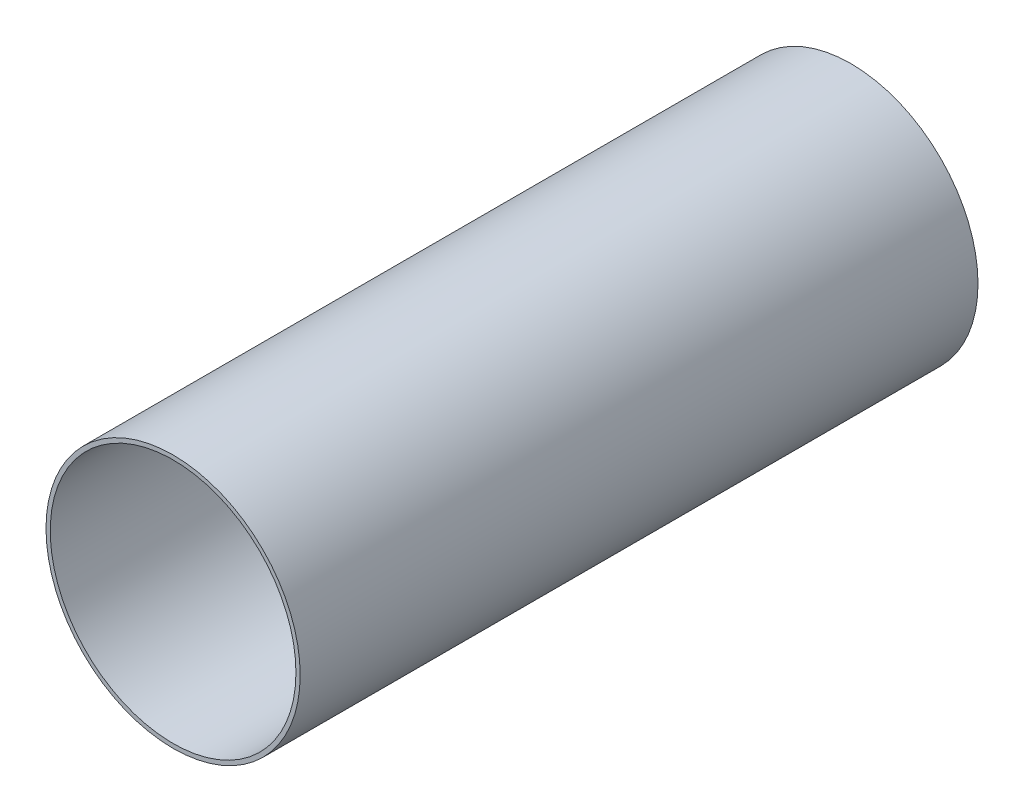
ISO-10303-21;
HEADER;
FILE_DESCRIPTION(('STEP AP214'),'2;1');
FILE_NAME('part.step','',(''),(''),'','','');
FILE_SCHEMA(('AUTOMOTIVE_DESIGN { 1 0 10303 214 1 1 1 1 }'));
ENDSEC;
DATA;
#1=APPLICATION_CONTEXT('core data for automotive mechanical design processes');
#2=APPLICATION_PROTOCOL_DEFINITION('international standard','automotive_design',2000,#1);
#3=PRODUCT_CONTEXT('',#1,'mechanical');
#4=PRODUCT('Part','Part','',(#3));
#5=PRODUCT_RELATED_PRODUCT_CATEGORY('part','',(#4));
#6=PRODUCT_DEFINITION_FORMATION('','',#4);
#7=PRODUCT_DEFINITION_CONTEXT('part definition',#1,'design');
#8=PRODUCT_DEFINITION('design','',#6,#7);
#9=PRODUCT_DEFINITION_SHAPE('','',#8);
#10=(LENGTH_UNIT() NAMED_UNIT(*) SI_UNIT(.MILLI.,.METRE.));
#11=(NAMED_UNIT(*) PLANE_ANGLE_UNIT() SI_UNIT($,.RADIAN.));
#12=(NAMED_UNIT(*) SI_UNIT($,.STERADIAN.) SOLID_ANGLE_UNIT());
#13=UNCERTAINTY_MEASURE_WITH_UNIT(LENGTH_MEASURE(1.E-05),#10,'distance_accuracy_value','');
#14=(GEOMETRIC_REPRESENTATION_CONTEXT(3) GLOBAL_UNCERTAINTY_ASSIGNED_CONTEXT((#13)) GLOBAL_UNIT_ASSIGNED_CONTEXT((#10,
#11,#12)) REPRESENTATION_CONTEXT('',''));
#15=CARTESIAN_POINT('',(0.,0.,0.));
#16=DIRECTION('',(0.,0.,1.));
#17=DIRECTION('',(1.,0.,0.));
#18=AXIS2_PLACEMENT_3D('',#15,#16,#17);
#19=CARTESIAN_POINT('',(0.,0.,160.));
#20=DIRECTION('',(0.,0.,1.));
#21=DIRECTION('',(1.,0.,0.));
#22=AXIS2_PLACEMENT_3D('',#19,#20,#21);
#23=PLANE('',#22);
#24=CARTESIAN_POINT('',(0.,0.,160.));
#25=DIRECTION('',(0.,0.,1.));
#26=DIRECTION('',(1.,0.,0.));
#27=AXIS2_PLACEMENT_3D('',#24,#25,#26);
#28=CIRCLE('',#27,30.);
#29=CARTESIAN_POINT('',(30.,0.,160.));
#30=VERTEX_POINT('',#29);
#31=EDGE_CURVE('E10',#30,#30,#28,.T.);
#32=ORIENTED_EDGE('',*,*,#31,.T.);
#33=EDGE_LOOP('',(#32));
#34=FACE_BOUND('',#33,.T.);
#35=CARTESIAN_POINT('',(0.,0.,160.));
#36=DIRECTION('',(0.,0.,1.));
#37=DIRECTION('',(1.,0.,0.));
#38=AXIS2_PLACEMENT_3D('',#35,#36,#37);
#39=CIRCLE('',#38,29.);
#40=CARTESIAN_POINT('',(29.,0.,160.));
#41=VERTEX_POINT('',#40);
#42=EDGE_CURVE('E41',#41,#41,#39,.T.);
#43=ORIENTED_EDGE('',*,*,#42,.F.);
#44=EDGE_LOOP('',(#43));
#45=FACE_BOUND('',#44,.T.);
#46=ADVANCED_FACE('F30',(#34,#45),#23,.T.);
#47=CARTESIAN_POINT('',(0.,0.,0.));
#48=DIRECTION('',(0.,0.,1.));
#49=DIRECTION('',(1.,0.,0.));
#50=AXIS2_PLACEMENT_3D('',#47,#48,#49);
#51=PLANE('',#50);
#52=CARTESIAN_POINT('',(0.,0.,0.));
#53=DIRECTION('',(0.,0.,1.));
#54=DIRECTION('',(1.,0.,0.));
#55=AXIS2_PLACEMENT_3D('',#52,#53,#54);
#56=CIRCLE('',#55,30.);
#57=CARTESIAN_POINT('',(30.,0.,0.));
#58=VERTEX_POINT('',#57);
#59=EDGE_CURVE('E34',#58,#58,#56,.T.);
#60=ORIENTED_EDGE('',*,*,#59,.F.);
#61=EDGE_LOOP('',(#60));
#62=FACE_BOUND('',#61,.T.);
#63=CARTESIAN_POINT('',(0.,0.,0.));
#64=DIRECTION('',(0.,0.,1.));
#65=DIRECTION('',(1.,0.,0.));
#66=AXIS2_PLACEMENT_3D('',#63,#64,#65);
#67=CIRCLE('',#66,29.);
#68=CARTESIAN_POINT('',(29.,0.,0.));
#69=VERTEX_POINT('',#68);
#70=EDGE_CURVE('E43',#69,#69,#67,.T.);
#71=ORIENTED_EDGE('',*,*,#70,.T.);
#72=EDGE_LOOP('',(#71));
#73=FACE_BOUND('',#72,.T.);
#74=ADVANCED_FACE('F53',(#62,#73),#51,.F.);
#75=CARTESIAN_POINT('',(0.,0.,160.));
#76=DIRECTION('',(0.,0.,-1.));
#77=DIRECTION('',(-1.,0.,0.));
#78=AXIS2_PLACEMENT_3D('',#75,#76,#77);
#79=CYLINDRICAL_SURFACE('',#78,30.);
#80=ORIENTED_EDGE('',*,*,#31,.F.);
#81=EDGE_LOOP('',(#80));
#82=FACE_BOUND('',#81,.T.);
#83=ORIENTED_EDGE('',*,*,#59,.T.);
#84=EDGE_LOOP('',(#83));
#85=FACE_BOUND('',#84,.T.);
#86=ADVANCED_FACE('F32',(#82,#85),#79,.T.);
#87=CARTESIAN_POINT('',(0.,0.,160.));
#88=DIRECTION('',(0.,0.,-1.));
#89=DIRECTION('',(-1.,0.,0.));
#90=AXIS2_PLACEMENT_3D('',#87,#88,#89);
#91=CYLINDRICAL_SURFACE('',#90,29.);
#92=ORIENTED_EDGE('',*,*,#42,.T.);
#93=EDGE_LOOP('',(#92));
#94=FACE_BOUND('',#93,.T.);
#95=ORIENTED_EDGE('',*,*,#70,.F.);
#96=EDGE_LOOP('',(#95));
#97=FACE_BOUND('',#96,.T.);
#98=ADVANCED_FACE('F49',(#94,#97),#91,.F.);
#99=CLOSED_SHELL('',(#46,#74,#86,#98));
#100=MANIFOLD_SOLID_BREP('B2',#99);
#101=ADVANCED_BREP_SHAPE_REPRESENTATION('',(#18,#100),#14);
#102=SHAPE_DEFINITION_REPRESENTATION(#9,#101);
ENDSEC;
END-ISO-10303-21;
